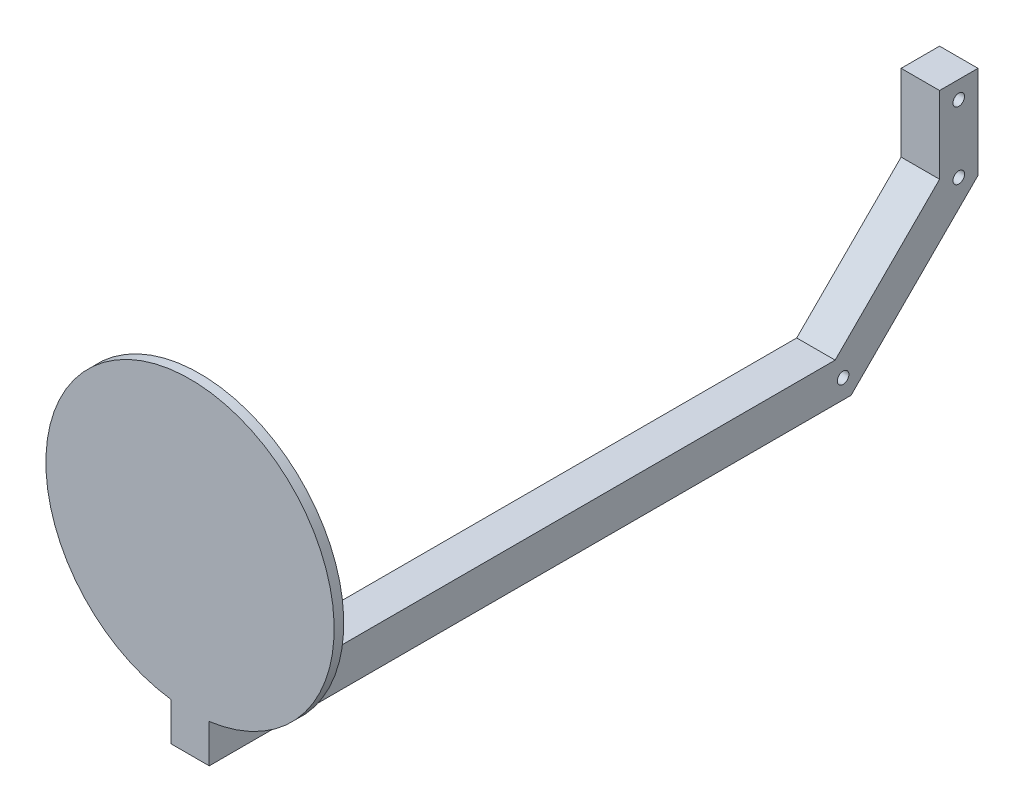
ISO-10303-21;
HEADER;
FILE_DESCRIPTION(('STEP AP214'),'2;1');
FILE_NAME('part.step','',(''),(''),'','','');
FILE_SCHEMA(('AUTOMOTIVE_DESIGN { 1 0 10303 214 1 1 1 1 }'));
ENDSEC;
DATA;
#1=APPLICATION_CONTEXT('core data for automotive mechanical design processes');
#2=APPLICATION_PROTOCOL_DEFINITION('international standard','automotive_design',2000,#1);
#3=PRODUCT_CONTEXT('',#1,'mechanical');
#4=PRODUCT('Part','Part','',(#3));
#5=PRODUCT_RELATED_PRODUCT_CATEGORY('part','',(#4));
#6=PRODUCT_DEFINITION_FORMATION('','',#4);
#7=PRODUCT_DEFINITION_CONTEXT('part definition',#1,'design');
#8=PRODUCT_DEFINITION('design','',#6,#7);
#9=PRODUCT_DEFINITION_SHAPE('','',#8);
#10=(LENGTH_UNIT() NAMED_UNIT(*) SI_UNIT(.MILLI.,.METRE.));
#11=(NAMED_UNIT(*) PLANE_ANGLE_UNIT() SI_UNIT($,.RADIAN.));
#12=(NAMED_UNIT(*) SI_UNIT($,.STERADIAN.) SOLID_ANGLE_UNIT());
#13=UNCERTAINTY_MEASURE_WITH_UNIT(LENGTH_MEASURE(1.E-05),#10,'distance_accuracy_value','');
#14=(GEOMETRIC_REPRESENTATION_CONTEXT(3) GLOBAL_UNCERTAINTY_ASSIGNED_CONTEXT((#13)) GLOBAL_UNIT_ASSIGNED_CONTEXT((#10,
#11,#12)) REPRESENTATION_CONTEXT('',''));
#15=CARTESIAN_POINT('',(0.,0.,0.));
#16=DIRECTION('',(0.,0.,1.));
#17=DIRECTION('',(1.,0.,0.));
#18=AXIS2_PLACEMENT_3D('',#15,#16,#17);
#19=CARTESIAN_POINT('',(10.,-74.3303437365925,5.));
#20=DIRECTION('',(-1.,0.,0.));
#21=DIRECTION('',(0.,-1.,0.));
#22=AXIS2_PLACEMENT_3D('',#19,#20,#21);
#23=PLANE('',#22);
#24=CARTESIAN_POINT('',(10.,-84.3303437365925,-25.));
#25=DIRECTION('',(1.,0.,0.));
#26=DIRECTION('',(0.,1.,0.));
#27=AXIS2_PLACEMENT_3D('',#24,#25,#26);
#28=CIRCLE('',#27,3.);
#29=CARTESIAN_POINT('',(10.,-81.3303437365925,-25.));
#30=VERTEX_POINT('',#29);
#31=EDGE_CURVE('E199',#30,#30,#28,.T.);
#32=ORIENTED_EDGE('',*,*,#31,.F.);
#33=EDGE_LOOP('',(#32));
#34=FACE_BOUND('',#33,.T.);
#35=CARTESIAN_POINT('',(9.99999999999999,10.857864376269,-385.));
#36=DIRECTION('',(1.,0.,0.));
#37=DIRECTION('',(0.,1.,0.));
#38=AXIS2_PLACEMENT_3D('',#35,#36,#37);
#39=CIRCLE('',#38,2.99999999999999);
#40=CARTESIAN_POINT('',(9.99999999999999,13.857864376269,-385.));
#41=VERTEX_POINT('',#40);
#42=EDGE_CURVE('E198',#41,#41,#39,.T.);
#43=ORIENTED_EDGE('',*,*,#42,.F.);
#44=EDGE_LOOP('',(#43));
#45=FACE_BOUND('',#44,.T.);
#46=CARTESIAN_POINT('',(9.99999999999999,-24.142135623731,-385.));
#47=DIRECTION('',(1.,0.,0.));
#48=DIRECTION('',(0.,1.,0.));
#49=AXIS2_PLACEMENT_3D('',#46,#47,#48);
#50=CIRCLE('',#49,2.99999999999999);
#51=CARTESIAN_POINT('',(9.99999999999999,-21.142135623731,-385.));
#52=VERTEX_POINT('',#51);
#53=EDGE_CURVE('E205',#52,#52,#50,.T.);
#54=ORIENTED_EDGE('',*,*,#53,.F.);
#55=EDGE_LOOP('',(#54));
#56=FACE_BOUND('',#55,.T.);
#57=CARTESIAN_POINT('',(10.,-84.3303437365925,-324.811791887138));
#58=DIRECTION('',(1.,0.,0.));
#59=DIRECTION('',(0.,1.,0.));
#60=AXIS2_PLACEMENT_3D('',#57,#58,#59);
#61=CIRCLE('',#60,2.99999999999999);
#62=CARTESIAN_POINT('',(10.,-81.3303437365925,-324.811791887138));
#63=VERTEX_POINT('',#62);
#64=EDGE_CURVE('E131',#63,#63,#61,.T.);
#65=ORIENTED_EDGE('',*,*,#64,.F.);
#66=EDGE_LOOP('',(#65));
#67=FACE_BOUND('',#66,.T.);
#68=DIRECTION('',(0.,0.,-1.));
#69=VECTOR('',#68,1.);
#70=CARTESIAN_POINT('',(10.,-94.3303437365925,5.));
#71=LINE('',#70,#69);
#72=CARTESIAN_POINT('',(10.,-94.3303437365925,5.));
#73=VERTEX_POINT('',#72);
#74=CARTESIAN_POINT('',(10.,-94.3303437365925,-328.953927510869));
#75=VERTEX_POINT('',#74);
#76=EDGE_CURVE('E103',#73,#75,#71,.T.);
#77=ORIENTED_EDGE('',*,*,#76,.T.);
#78=DIRECTION('',(0.,0.707106781186544,-0.707106781186551));
#79=VECTOR('',#78,1.);
#80=CARTESIAN_POINT('',(10.,-94.3303437365925,-328.953927510869));
#81=LINE('',#80,#79);
#82=CARTESIAN_POINT('',(9.99999999999999,-28.2842712474619,-395.));
#83=VERTEX_POINT('',#82);
#84=EDGE_CURVE('E107',#75,#83,#81,.T.);
#85=ORIENTED_EDGE('',*,*,#84,.T.);
#86=DIRECTION('',(0.,1.,0.));
#87=VECTOR('',#86,1.);
#88=CARTESIAN_POINT('',(9.99999999999999,-28.2842712474619,-395.));
#89=LINE('',#88,#87);
#90=CARTESIAN_POINT('',(9.99999999999999,20.,-395.));
#91=VERTEX_POINT('',#90);
#92=EDGE_CURVE('E125',#83,#91,#89,.T.);
#93=ORIENTED_EDGE('',*,*,#92,.T.);
#94=DIRECTION('',(0.,0.,1.));
#95=VECTOR('',#94,1.);
#96=CARTESIAN_POINT('',(9.99999999999999,20.,-395.));
#97=LINE('',#96,#95);
#98=CARTESIAN_POINT('',(9.99999999999999,20.,-375.));
#99=VERTEX_POINT('',#98);
#100=EDGE_CURVE('E128',#91,#99,#97,.T.);
#101=ORIENTED_EDGE('',*,*,#100,.T.);
#102=DIRECTION('',(0.,-1.,0.));
#103=VECTOR('',#102,1.);
#104=CARTESIAN_POINT('',(9.99999999999999,20.,-375.));
#105=LINE('',#104,#103);
#106=CARTESIAN_POINT('',(9.99999999999999,-20.,-375.));
#107=VERTEX_POINT('',#106);
#108=EDGE_CURVE('E139',#99,#107,#105,.T.);
#109=ORIENTED_EDGE('',*,*,#108,.T.);
#110=DIRECTION('',(0.,-0.707106781186544,0.707106781186551));
#111=VECTOR('',#110,1.);
#112=CARTESIAN_POINT('',(9.99999999999999,-20.,-375.));
#113=LINE('',#112,#111);
#114=CARTESIAN_POINT('',(10.,-74.3303437365925,-320.669656263407));
#115=VERTEX_POINT('',#114);
#116=EDGE_CURVE('E142',#107,#115,#113,.T.);
#117=ORIENTED_EDGE('',*,*,#116,.T.);
#118=DIRECTION('',(0.,0.,1.));
#119=VECTOR('',#118,1.);
#120=CARTESIAN_POINT('',(10.,-74.3303437365925,5.));
#121=LINE('',#120,#119);
#122=CARTESIAN_POINT('',(10.,-74.3303437365925,0.));
#123=VERTEX_POINT('',#122);
#124=EDGE_CURVE('E120',#115,#123,#121,.T.);
#125=ORIENTED_EDGE('',*,*,#124,.T.);
#126=DIRECTION('',(0.,0.,-1.));
#127=VECTOR('',#126,1.);
#128=CARTESIAN_POINT('',(9.99999999999997,-74.3303437365925,5.));
#129=LINE('',#128,#127);
#130=CARTESIAN_POINT('',(9.99999999999997,-74.3303437365925,5.));
#131=VERTEX_POINT('',#130);
#132=EDGE_CURVE('E40',#131,#123,#129,.T.);
#133=ORIENTED_EDGE('',*,*,#132,.F.);
#134=DIRECTION('',(0.,1.,0.));
#135=VECTOR('',#134,1.);
#136=CARTESIAN_POINT('',(10.,-74.3303437365925,5.));
#137=LINE('',#136,#135);
#138=EDGE_CURVE('E109',#73,#131,#137,.T.);
#139=ORIENTED_EDGE('',*,*,#138,.F.);
#140=EDGE_LOOP('',(#77,#85,#93,#101,#109,#117,#125,#133,#139));
#141=FACE_BOUND('',#140,.T.);
#142=ADVANCED_FACE('F33',(#34,#45,#56,#67,#141),#23,.F.);
#143=CARTESIAN_POINT('',(0.,0.,5.));
#144=DIRECTION('',(0.,0.,-1.));
#145=DIRECTION('',(-1.,0.,0.));
#146=AXIS2_PLACEMENT_3D('',#143,#144,#145);
#147=CYLINDRICAL_SURFACE('',#146,75.);
#148=CARTESIAN_POINT('',(0.,0.,0.));
#149=DIRECTION('',(0.,0.,1.));
#150=DIRECTION('',(1.,0.,0.));
#151=AXIS2_PLACEMENT_3D('',#148,#149,#150);
#152=CIRCLE('',#151,75.);
#153=CARTESIAN_POINT('',(-10.,-74.3303437365925,0.));
#154=VERTEX_POINT('',#153);
#155=EDGE_CURVE('E159',#123,#154,#152,.T.);
#156=ORIENTED_EDGE('',*,*,#155,.T.);
#157=DIRECTION('',(0.,0.,-1.));
#158=VECTOR('',#157,1.);
#159=CARTESIAN_POINT('',(-10.,-74.3303437365925,5.));
#160=LINE('',#159,#158);
#161=CARTESIAN_POINT('',(-10.,-74.3303437365925,5.));
#162=VERTEX_POINT('',#161);
#163=EDGE_CURVE('E168',#162,#154,#160,.T.);
#164=ORIENTED_EDGE('',*,*,#163,.F.);
#165=CARTESIAN_POINT('',(0.,0.,5.));
#166=DIRECTION('',(0.,0.,1.));
#167=DIRECTION('',(1.,0.,0.));
#168=AXIS2_PLACEMENT_3D('',#165,#166,#167);
#169=CIRCLE('',#168,75.);
#170=EDGE_CURVE('E161',#131,#162,#169,.T.);
#171=ORIENTED_EDGE('',*,*,#170,.F.);
#172=ORIENTED_EDGE('',*,*,#132,.T.);
#173=EDGE_LOOP('',(#156,#164,#171,#172));
#174=FACE_BOUND('',#173,.T.);
#175=ADVANCED_FACE('F172',(#174),#147,.T.);
#176=CARTESIAN_POINT('',(-10.,-74.3303437365925,5.));
#177=DIRECTION('',(1.,0.,0.));
#178=DIRECTION('',(0.,0.,-1.));
#179=AXIS2_PLACEMENT_3D('',#176,#177,#178);
#180=PLANE('',#179);
#181=CARTESIAN_POINT('',(-10.,-84.3303437365925,-25.));
#182=DIRECTION('',(1.,0.,0.));
#183=DIRECTION('',(0.,0.,-1.));
#184=AXIS2_PLACEMENT_3D('',#181,#182,#183);
#185=CIRCLE('',#184,3.);
#186=CARTESIAN_POINT('',(-10.,-84.3303437365925,-28.));
#187=VERTEX_POINT('',#186);
#188=EDGE_CURVE('E195',#187,#187,#185,.F.);
#189=ORIENTED_EDGE('',*,*,#188,.F.);
#190=EDGE_LOOP('',(#189));
#191=FACE_BOUND('',#190,.T.);
#192=CARTESIAN_POINT('',(-10.,10.857864376269,-385.));
#193=DIRECTION('',(1.,0.,0.));
#194=DIRECTION('',(0.,0.,-1.));
#195=AXIS2_PLACEMENT_3D('',#192,#193,#194);
#196=CIRCLE('',#195,2.99999999999999);
#197=CARTESIAN_POINT('',(-10.,10.857864376269,-388.));
#198=VERTEX_POINT('',#197);
#199=EDGE_CURVE('E202',#198,#198,#196,.F.);
#200=ORIENTED_EDGE('',*,*,#199,.F.);
#201=EDGE_LOOP('',(#200));
#202=FACE_BOUND('',#201,.T.);
#203=CARTESIAN_POINT('',(-10.,-24.142135623731,-385.));
#204=DIRECTION('',(1.,0.,0.));
#205=DIRECTION('',(0.,0.,-1.));
#206=AXIS2_PLACEMENT_3D('',#203,#204,#205);
#207=CIRCLE('',#206,2.99999999999999);
#208=CARTESIAN_POINT('',(-10.,-24.142135623731,-388.));
#209=VERTEX_POINT('',#208);
#210=EDGE_CURVE('E194',#209,#209,#207,.F.);
#211=ORIENTED_EDGE('',*,*,#210,.F.);
#212=EDGE_LOOP('',(#211));
#213=FACE_BOUND('',#212,.T.);
#214=CARTESIAN_POINT('',(-10.,-84.3303437365925,-324.811791887138));
#215=DIRECTION('',(1.,0.,0.));
#216=DIRECTION('',(0.,0.,-1.));
#217=AXIS2_PLACEMENT_3D('',#214,#215,#216);
#218=CIRCLE('',#217,2.99999999999999);
#219=CARTESIAN_POINT('',(-10.,-84.3303437365925,-327.811791887138));
#220=VERTEX_POINT('',#219);
#221=EDGE_CURVE('E126',#220,#220,#218,.F.);
#222=ORIENTED_EDGE('',*,*,#221,.F.);
#223=EDGE_LOOP('',(#222));
#224=FACE_BOUND('',#223,.T.);
#225=ORIENTED_EDGE('',*,*,#163,.T.);
#226=DIRECTION('',(0.,0.,-1.));
#227=VECTOR('',#226,1.);
#228=CARTESIAN_POINT('',(-10.,-74.3303437365925,5.));
#229=LINE('',#228,#227);
#230=CARTESIAN_POINT('',(-10.,-74.3303437365925,-320.669656263407));
#231=VERTEX_POINT('',#230);
#232=EDGE_CURVE('E134',#154,#231,#229,.T.);
#233=ORIENTED_EDGE('',*,*,#232,.T.);
#234=DIRECTION('',(0.,0.707106781186544,-0.707106781186551));
#235=VECTOR('',#234,1.);
#236=CARTESIAN_POINT('',(-10.,-20.,-375.));
#237=LINE('',#236,#235);
#238=CARTESIAN_POINT('',(-10.,-20.,-375.));
#239=VERTEX_POINT('',#238);
#240=EDGE_CURVE('E184',#231,#239,#237,.T.);
#241=ORIENTED_EDGE('',*,*,#240,.T.);
#242=DIRECTION('',(0.,1.,0.));
#243=VECTOR('',#242,1.);
#244=CARTESIAN_POINT('',(-10.,20.,-375.));
#245=LINE('',#244,#243);
#246=CARTESIAN_POINT('',(-10.,20.,-375.));
#247=VERTEX_POINT('',#246);
#248=EDGE_CURVE('E185',#239,#247,#245,.T.);
#249=ORIENTED_EDGE('',*,*,#248,.T.);
#250=DIRECTION('',(0.,0.,-1.));
#251=VECTOR('',#250,1.);
#252=CARTESIAN_POINT('',(-10.,20.,-395.));
#253=LINE('',#252,#251);
#254=CARTESIAN_POINT('',(-10.,20.,-395.));
#255=VERTEX_POINT('',#254);
#256=EDGE_CURVE('E187',#247,#255,#253,.T.);
#257=ORIENTED_EDGE('',*,*,#256,.T.);
#258=DIRECTION('',(0.,-1.,0.));
#259=VECTOR('',#258,1.);
#260=CARTESIAN_POINT('',(-10.,-28.284271247462,-395.));
#261=LINE('',#260,#259);
#262=CARTESIAN_POINT('',(-10.,-28.2842712474619,-395.));
#263=VERTEX_POINT('',#262);
#264=EDGE_CURVE('E149',#255,#263,#261,.T.);
#265=ORIENTED_EDGE('',*,*,#264,.T.);
#266=DIRECTION('',(0.,-0.707106781186544,0.707106781186551));
#267=VECTOR('',#266,1.);
#268=CARTESIAN_POINT('',(-10.,-94.3303437365925,-328.953927510869));
#269=LINE('',#268,#267);
#270=CARTESIAN_POINT('',(-10.,-94.3303437365925,-328.953927510869));
#271=VERTEX_POINT('',#270);
#272=EDGE_CURVE('E157',#263,#271,#269,.T.);
#273=ORIENTED_EDGE('',*,*,#272,.T.);
#274=DIRECTION('',(0.,0.,-1.));
#275=VECTOR('',#274,1.);
#276=CARTESIAN_POINT('',(-10.,-94.3303437365925,5.));
#277=LINE('',#276,#275);
#278=CARTESIAN_POINT('',(-10.,-94.3303437365925,5.));
#279=VERTEX_POINT('',#278);
#280=EDGE_CURVE('E111',#279,#271,#277,.T.);
#281=ORIENTED_EDGE('',*,*,#280,.F.);
#282=DIRECTION('',(0.,-1.,0.));
#283=VECTOR('',#282,1.);
#284=CARTESIAN_POINT('',(-10.,-74.3303437365925,5.));
#285=LINE('',#284,#283);
#286=EDGE_CURVE('E52',#162,#279,#285,.T.);
#287=ORIENTED_EDGE('',*,*,#286,.F.);
#288=EDGE_LOOP('',(#225,#233,#241,#249,#257,#265,#273,#281,#287));
#289=FACE_BOUND('',#288,.T.);
#290=ADVANCED_FACE('F261',(#191,#202,#213,#224,#289),#180,.F.);
#291=CARTESIAN_POINT('',(-10.,-94.3303437365925,5.));
#292=DIRECTION('',(0.,1.,0.));
#293=DIRECTION('',(0.,0.,1.));
#294=AXIS2_PLACEMENT_3D('',#291,#292,#293);
#295=PLANE('',#294);
#296=ORIENTED_EDGE('',*,*,#280,.T.);
#297=DIRECTION('',(1.,0.,0.));
#298=VECTOR('',#297,1.);
#299=CARTESIAN_POINT('',(-426.018542253741,-94.3303437365925,-328.953927510869));
#300=LINE('',#299,#298);
#301=EDGE_CURVE('E114',#271,#75,#300,.T.);
#302=ORIENTED_EDGE('',*,*,#301,.T.);
#303=ORIENTED_EDGE('',*,*,#76,.F.);
#304=DIRECTION('',(1.,0.,0.));
#305=VECTOR('',#304,1.);
#306=CARTESIAN_POINT('',(-10.,-94.3303437365925,5.));
#307=LINE('',#306,#305);
#308=EDGE_CURVE('E47',#279,#73,#307,.T.);
#309=ORIENTED_EDGE('',*,*,#308,.F.);
#310=EDGE_LOOP('',(#296,#302,#303,#309));
#311=FACE_BOUND('',#310,.T.);
#312=ADVANCED_FACE('F115',(#311),#295,.F.);
#313=CARTESIAN_POINT('',(0.,0.,5.));
#314=DIRECTION('',(0.,0.,1.));
#315=DIRECTION('',(1.,0.,0.));
#316=AXIS2_PLACEMENT_3D('',#313,#314,#315);
#317=PLANE('',#316);
#318=ORIENTED_EDGE('',*,*,#170,.T.);
#319=ORIENTED_EDGE('',*,*,#286,.T.);
#320=ORIENTED_EDGE('',*,*,#308,.T.);
#321=ORIENTED_EDGE('',*,*,#138,.T.);
#322=EDGE_LOOP('',(#318,#319,#320,#321));
#323=FACE_BOUND('',#322,.T.);
#324=ADVANCED_FACE('F254',(#323),#317,.T.);
#325=CARTESIAN_POINT('',(0.,0.,0.));
#326=DIRECTION('',(0.,0.,1.));
#327=DIRECTION('',(1.,0.,0.));
#328=AXIS2_PLACEMENT_3D('',#325,#326,#327);
#329=PLANE('',#328);
#330=ORIENTED_EDGE('',*,*,#155,.F.);
#331=DIRECTION('',(-1.,0.,0.));
#332=VECTOR('',#331,1.);
#333=CARTESIAN_POINT('',(0.,-74.3303437365925,0.));
#334=LINE('',#333,#332);
#335=EDGE_CURVE('E11',#123,#154,#334,.T.);
#336=ORIENTED_EDGE('',*,*,#335,.T.);
#337=EDGE_LOOP('',(#330,#336));
#338=FACE_BOUND('',#337,.T.);
#339=ADVANCED_FACE('F180',(#338),#329,.F.);
#340=CARTESIAN_POINT('',(-426.018542253741,-74.3303437365926,5.));
#341=DIRECTION('',(0.,1.,0.));
#342=DIRECTION('',(-1.,0.,0.));
#343=AXIS2_PLACEMENT_3D('',#340,#341,#342);
#344=PLANE('',#343);
#345=ORIENTED_EDGE('',*,*,#335,.F.);
#346=ORIENTED_EDGE('',*,*,#124,.F.);
#347=DIRECTION('',(1.,0.,0.));
#348=VECTOR('',#347,1.);
#349=CARTESIAN_POINT('',(-426.018542253741,-74.3303437365926,-320.669656263407));
#350=LINE('',#349,#348);
#351=EDGE_CURVE('E147',#231,#115,#350,.T.);
#352=ORIENTED_EDGE('',*,*,#351,.F.);
#353=ORIENTED_EDGE('',*,*,#232,.F.);
#354=EDGE_LOOP('',(#345,#346,#352,#353));
#355=FACE_BOUND('',#354,.T.);
#356=ADVANCED_FACE('F181',(#355),#344,.T.);
#357=CARTESIAN_POINT('',(-426.018542253741,-20.,-375.));
#358=DIRECTION('',(0.,0.707106781186551,0.707106781186544));
#359=DIRECTION('',(0.,-0.707106781186544,0.707106781186551));
#360=AXIS2_PLACEMENT_3D('',#357,#358,#359);
#361=PLANE('',#360);
#362=ORIENTED_EDGE('',*,*,#240,.F.);
#363=ORIENTED_EDGE('',*,*,#351,.T.);
#364=ORIENTED_EDGE('',*,*,#116,.F.);
#365=DIRECTION('',(1.,0.,0.));
#366=VECTOR('',#365,1.);
#367=CARTESIAN_POINT('',(-426.018542253741,-20.,-375.));
#368=LINE('',#367,#366);
#369=EDGE_CURVE('E150',#239,#107,#368,.T.);
#370=ORIENTED_EDGE('',*,*,#369,.F.);
#371=EDGE_LOOP('',(#362,#363,#364,#370));
#372=FACE_BOUND('',#371,.T.);
#373=ADVANCED_FACE('F239',(#372),#361,.T.);
#374=CARTESIAN_POINT('',(-426.018542253741,20.,-375.));
#375=DIRECTION('',(0.,0.,1.));
#376=DIRECTION('',(1.,0.,0.));
#377=AXIS2_PLACEMENT_3D('',#374,#375,#376);
#378=PLANE('',#377);
#379=ORIENTED_EDGE('',*,*,#248,.F.);
#380=ORIENTED_EDGE('',*,*,#369,.T.);
#381=ORIENTED_EDGE('',*,*,#108,.F.);
#382=DIRECTION('',(1.,0.,0.));
#383=VECTOR('',#382,1.);
#384=CARTESIAN_POINT('',(-426.018542253741,20.,-375.));
#385=LINE('',#384,#383);
#386=EDGE_CURVE('E152',#247,#99,#385,.T.);
#387=ORIENTED_EDGE('',*,*,#386,.F.);
#388=EDGE_LOOP('',(#379,#380,#381,#387));
#389=FACE_BOUND('',#388,.T.);
#390=ADVANCED_FACE('F242',(#389),#378,.T.);
#391=CARTESIAN_POINT('',(-426.018542253741,20.,-395.));
#392=DIRECTION('',(0.,1.,0.));
#393=DIRECTION('',(0.,0.,1.));
#394=AXIS2_PLACEMENT_3D('',#391,#392,#393);
#395=PLANE('',#394);
#396=ORIENTED_EDGE('',*,*,#256,.F.);
#397=ORIENTED_EDGE('',*,*,#386,.T.);
#398=ORIENTED_EDGE('',*,*,#100,.F.);
#399=DIRECTION('',(1.,0.,0.));
#400=VECTOR('',#399,1.);
#401=CARTESIAN_POINT('',(-426.018542253741,20.,-395.));
#402=LINE('',#401,#400);
#403=EDGE_CURVE('E154',#255,#91,#402,.T.);
#404=ORIENTED_EDGE('',*,*,#403,.F.);
#405=EDGE_LOOP('',(#396,#397,#398,#404));
#406=FACE_BOUND('',#405,.T.);
#407=ADVANCED_FACE('F246',(#406),#395,.T.);
#408=CARTESIAN_POINT('',(-426.018542253741,-28.284271247462,-395.));
#409=DIRECTION('',(0.,0.,-1.));
#410=DIRECTION('',(-1.,0.,0.));
#411=AXIS2_PLACEMENT_3D('',#408,#409,#410);
#412=PLANE('',#411);
#413=ORIENTED_EDGE('',*,*,#264,.F.);
#414=ORIENTED_EDGE('',*,*,#403,.T.);
#415=ORIENTED_EDGE('',*,*,#92,.F.);
#416=DIRECTION('',(1.,0.,0.));
#417=VECTOR('',#416,1.);
#418=CARTESIAN_POINT('',(-426.018542253741,-28.284271247462,-395.));
#419=LINE('',#418,#417);
#420=EDGE_CURVE('E119',#263,#83,#419,.T.);
#421=ORIENTED_EDGE('',*,*,#420,.F.);
#422=EDGE_LOOP('',(#413,#414,#415,#421));
#423=FACE_BOUND('',#422,.T.);
#424=ADVANCED_FACE('F231',(#423),#412,.T.);
#425=CARTESIAN_POINT('',(-426.018542253741,-94.3303437365925,-328.953927510869));
#426=DIRECTION('',(0.,-0.707106781186551,-0.707106781186544));
#427=DIRECTION('',(0.,0.707106781186544,-0.707106781186551));
#428=AXIS2_PLACEMENT_3D('',#425,#426,#427);
#429=PLANE('',#428);
#430=ORIENTED_EDGE('',*,*,#272,.F.);
#431=ORIENTED_EDGE('',*,*,#420,.T.);
#432=ORIENTED_EDGE('',*,*,#84,.F.);
#433=ORIENTED_EDGE('',*,*,#301,.F.);
#434=EDGE_LOOP('',(#430,#431,#432,#433));
#435=FACE_BOUND('',#434,.T.);
#436=ADVANCED_FACE('F122',(#435),#429,.T.);
#437=CARTESIAN_POINT('',(-18.4852813742386,-84.3303437365925,-324.811791887138));
#438=DIRECTION('',(1.,0.,0.));
#439=DIRECTION('',(0.,1.,0.));
#440=AXIS2_PLACEMENT_3D('',#437,#438,#439);
#441=CYLINDRICAL_SURFACE('',#440,2.99999999999999);
#442=ORIENTED_EDGE('',*,*,#221,.T.);
#443=EDGE_LOOP('',(#442));
#444=FACE_BOUND('',#443,.T.);
#445=ORIENTED_EDGE('',*,*,#64,.T.);
#446=EDGE_LOOP('',(#445));
#447=FACE_BOUND('',#446,.T.);
#448=ADVANCED_FACE('F220',(#444,#447),#441,.F.);
#449=CARTESIAN_POINT('',(-18.4852813742386,-24.142135623731,-385.));
#450=DIRECTION('',(1.,0.,0.));
#451=DIRECTION('',(0.,1.,0.));
#452=AXIS2_PLACEMENT_3D('',#449,#450,#451);
#453=CYLINDRICAL_SURFACE('',#452,2.99999999999999);
#454=ORIENTED_EDGE('',*,*,#210,.T.);
#455=EDGE_LOOP('',(#454));
#456=FACE_BOUND('',#455,.T.);
#457=ORIENTED_EDGE('',*,*,#53,.T.);
#458=EDGE_LOOP('',(#457));
#459=FACE_BOUND('',#458,.T.);
#460=ADVANCED_FACE('F213',(#456,#459),#453,.F.);
#461=CARTESIAN_POINT('',(-18.4852813742386,10.857864376269,-385.));
#462=DIRECTION('',(1.,0.,0.));
#463=DIRECTION('',(0.,1.,0.));
#464=AXIS2_PLACEMENT_3D('',#461,#462,#463);
#465=CYLINDRICAL_SURFACE('',#464,2.99999999999999);
#466=ORIENTED_EDGE('',*,*,#199,.T.);
#467=EDGE_LOOP('',(#466));
#468=FACE_BOUND('',#467,.T.);
#469=ORIENTED_EDGE('',*,*,#42,.T.);
#470=EDGE_LOOP('',(#469));
#471=FACE_BOUND('',#470,.T.);
#472=ADVANCED_FACE('F228',(#468,#471),#465,.F.);
#473=CARTESIAN_POINT('',(-18.4852813742386,-84.3303437365925,-25.));
#474=DIRECTION('',(1.,0.,0.));
#475=DIRECTION('',(0.,1.,0.));
#476=AXIS2_PLACEMENT_3D('',#473,#474,#475);
#477=CYLINDRICAL_SURFACE('',#476,3.);
#478=ORIENTED_EDGE('',*,*,#188,.T.);
#479=EDGE_LOOP('',(#478));
#480=FACE_BOUND('',#479,.T.);
#481=ORIENTED_EDGE('',*,*,#31,.T.);
#482=EDGE_LOOP('',(#481));
#483=FACE_BOUND('',#482,.T.);
#484=ADVANCED_FACE('F235',(#480,#483),#477,.F.);
#485=CLOSED_SHELL('',(#142,#175,#290,#312,#324,#339,#356,#373,#390,#407,#424,#436,#448,#460,
#472,#484));
#486=MANIFOLD_SOLID_BREP('B2',#485);
#487=ADVANCED_BREP_SHAPE_REPRESENTATION('',(#18,#486),#14);
#488=SHAPE_DEFINITION_REPRESENTATION(#9,#487);
ENDSEC;
END-ISO-10303-21;
